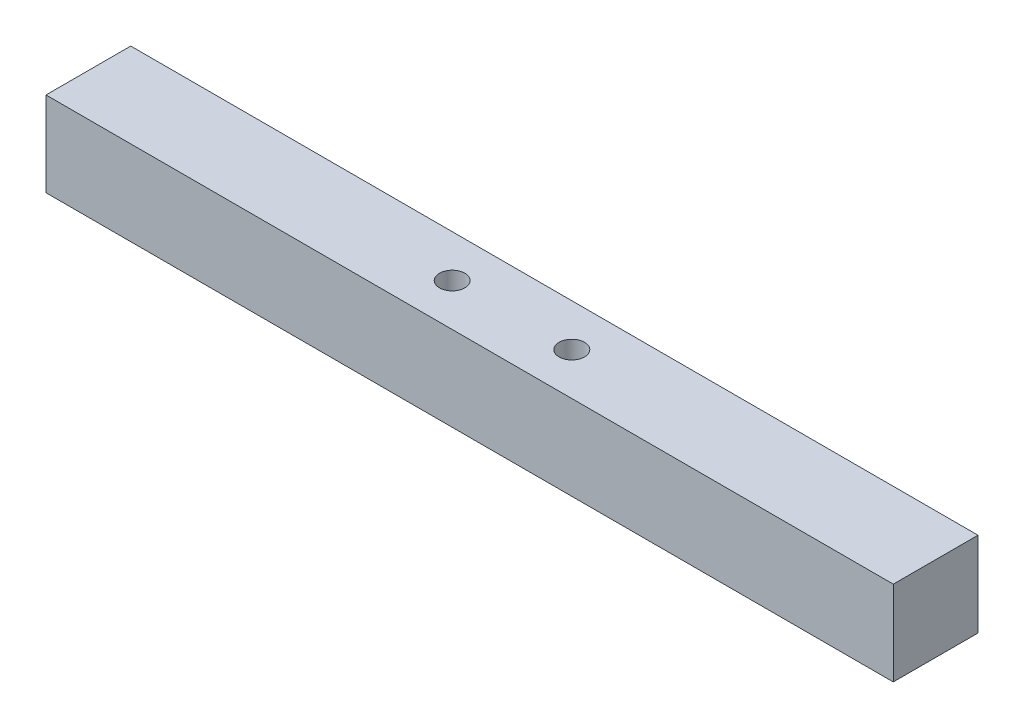
ISO-10303-21;
HEADER;
FILE_DESCRIPTION(('STEP AP214'),'2;1');
FILE_NAME('part.step','',(''),(''),'','','');
FILE_SCHEMA(('AUTOMOTIVE_DESIGN { 1 0 10303 214 1 1 1 1 }'));
ENDSEC;
DATA;
#1=APPLICATION_CONTEXT('core data for automotive mechanical design processes');
#2=APPLICATION_PROTOCOL_DEFINITION('international standard','automotive_design',2000,#1);
#3=PRODUCT_CONTEXT('',#1,'mechanical');
#4=PRODUCT('Part','Part','',(#3));
#5=PRODUCT_RELATED_PRODUCT_CATEGORY('part','',(#4));
#6=PRODUCT_DEFINITION_FORMATION('','',#4);
#7=PRODUCT_DEFINITION_CONTEXT('part definition',#1,'design');
#8=PRODUCT_DEFINITION('design','',#6,#7);
#9=PRODUCT_DEFINITION_SHAPE('','',#8);
#10=(LENGTH_UNIT() NAMED_UNIT(*) SI_UNIT(.MILLI.,.METRE.));
#11=(NAMED_UNIT(*) PLANE_ANGLE_UNIT() SI_UNIT($,.RADIAN.));
#12=(NAMED_UNIT(*) SI_UNIT($,.STERADIAN.) SOLID_ANGLE_UNIT());
#13=UNCERTAINTY_MEASURE_WITH_UNIT(LENGTH_MEASURE(1.E-05),#10,'distance_accuracy_value','');
#14=(GEOMETRIC_REPRESENTATION_CONTEXT(3) GLOBAL_UNCERTAINTY_ASSIGNED_CONTEXT((#13)) GLOBAL_UNIT_ASSIGNED_CONTEXT((#10,
#11,#12)) REPRESENTATION_CONTEXT('',''));
#15=CARTESIAN_POINT('',(0.,0.,0.));
#16=DIRECTION('',(0.,0.,1.));
#17=DIRECTION('',(1.,0.,0.));
#18=AXIS2_PLACEMENT_3D('',#15,#16,#17);
#19=CARTESIAN_POINT('',(200.,-10.,-10.));
#20=DIRECTION('',(0.,0.,1.));
#21=DIRECTION('',(1.,0.,0.));
#22=AXIS2_PLACEMENT_3D('',#19,#20,#21);
#23=PLANE('',#22);
#24=DIRECTION('',(0.,1.,0.));
#25=VECTOR('',#24,1.);
#26=CARTESIAN_POINT('',(0.,-10.,-10.));
#27=LINE('',#26,#25);
#28=CARTESIAN_POINT('',(0.,-10.,-10.));
#29=VERTEX_POINT('',#28);
#30=CARTESIAN_POINT('',(0.,10.,-10.));
#31=VERTEX_POINT('',#30);
#32=EDGE_CURVE('E96',#29,#31,#27,.T.);
#33=ORIENTED_EDGE('',*,*,#32,.T.);
#34=DIRECTION('',(-1.,0.,0.));
#35=VECTOR('',#34,1.);
#36=CARTESIAN_POINT('',(200.,10.,-10.));
#37=LINE('',#36,#35);
#38=CARTESIAN_POINT('',(200.,10.,-10.));
#39=VERTEX_POINT('',#38);
#40=EDGE_CURVE('E11',#39,#31,#37,.T.);
#41=ORIENTED_EDGE('',*,*,#40,.F.);
#42=DIRECTION('',(0.,1.,0.));
#43=VECTOR('',#42,1.);
#44=CARTESIAN_POINT('',(200.,-10.,-10.));
#45=LINE('',#44,#43);
#46=CARTESIAN_POINT('',(200.,-10.,-10.));
#47=VERTEX_POINT('',#46);
#48=EDGE_CURVE('E84',#47,#39,#45,.T.);
#49=ORIENTED_EDGE('',*,*,#48,.F.);
#50=DIRECTION('',(-1.,0.,0.));
#51=VECTOR('',#50,1.);
#52=CARTESIAN_POINT('',(200.,-10.,-10.));
#53=LINE('',#52,#51);
#54=EDGE_CURVE('E92',#47,#29,#53,.T.);
#55=ORIENTED_EDGE('',*,*,#54,.T.);
#56=EDGE_LOOP('',(#33,#41,#49,#55));
#57=FACE_BOUND('',#56,.T.);
#58=ADVANCED_FACE('F33',(#57),#23,.F.);
#59=CARTESIAN_POINT('',(200.,10.,10.));
#60=DIRECTION('',(0.,-1.,0.));
#61=DIRECTION('',(0.,0.,-1.));
#62=AXIS2_PLACEMENT_3D('',#59,#60,#61);
#63=PLANE('',#62);
#64=CARTESIAN_POINT('',(85.88,10.,0.));
#65=DIRECTION('',(0.,1.,0.));
#66=DIRECTION('',(0.,0.,1.));
#67=AXIS2_PLACEMENT_3D('',#64,#65,#66);
#68=CIRCLE('',#67,3.00000000000001);
#69=CARTESIAN_POINT('',(85.88,10.,3.00000000000001));
#70=VERTEX_POINT('',#69);
#71=EDGE_CURVE('E116',#70,#70,#68,.T.);
#72=ORIENTED_EDGE('',*,*,#71,.F.);
#73=EDGE_LOOP('',(#72));
#74=FACE_BOUND('',#73,.T.);
#75=CARTESIAN_POINT('',(114.12,10.,0.));
#76=DIRECTION('',(0.,1.,0.));
#77=DIRECTION('',(0.,0.,-1.));
#78=AXIS2_PLACEMENT_3D('',#75,#76,#77);
#79=CIRCLE('',#78,3.00000000000001);
#80=CARTESIAN_POINT('',(114.12,10.,-3.00000000000001));
#81=VERTEX_POINT('',#80);
#82=EDGE_CURVE('E110',#81,#81,#79,.T.);
#83=ORIENTED_EDGE('',*,*,#82,.F.);
#84=EDGE_LOOP('',(#83));
#85=FACE_BOUND('',#84,.T.);
#86=DIRECTION('',(0.,0.,1.));
#87=VECTOR('',#86,1.);
#88=CARTESIAN_POINT('',(0.,10.,10.));
#89=LINE('',#88,#87);
#90=CARTESIAN_POINT('',(0.,10.,10.));
#91=VERTEX_POINT('',#90);
#92=EDGE_CURVE('E88',#31,#91,#89,.T.);
#93=ORIENTED_EDGE('',*,*,#92,.T.);
#94=DIRECTION('',(-1.,0.,0.));
#95=VECTOR('',#94,1.);
#96=CARTESIAN_POINT('',(200.,10.,10.));
#97=LINE('',#96,#95);
#98=CARTESIAN_POINT('',(200.,10.,10.));
#99=VERTEX_POINT('',#98);
#100=EDGE_CURVE('E41',#99,#91,#97,.T.);
#101=ORIENTED_EDGE('',*,*,#100,.F.);
#102=DIRECTION('',(0.,0.,1.));
#103=VECTOR('',#102,1.);
#104=CARTESIAN_POINT('',(200.,10.,10.));
#105=LINE('',#104,#103);
#106=EDGE_CURVE('E79',#39,#99,#105,.T.);
#107=ORIENTED_EDGE('',*,*,#106,.F.);
#108=ORIENTED_EDGE('',*,*,#40,.T.);
#109=EDGE_LOOP('',(#93,#101,#107,#108));
#110=FACE_BOUND('',#109,.T.);
#111=ADVANCED_FACE('F87',(#74,#85,#110),#63,.F.);
#112=CARTESIAN_POINT('',(200.,-10.,10.));
#113=DIRECTION('',(0.,0.,-1.));
#114=DIRECTION('',(-1.,0.,0.));
#115=AXIS2_PLACEMENT_3D('',#112,#113,#114);
#116=PLANE('',#115);
#117=DIRECTION('',(0.,-1.,0.));
#118=VECTOR('',#117,1.);
#119=CARTESIAN_POINT('',(0.,-10.,10.));
#120=LINE('',#119,#118);
#121=CARTESIAN_POINT('',(0.,-10.,10.));
#122=VERTEX_POINT('',#121);
#123=EDGE_CURVE('E66',#91,#122,#120,.T.);
#124=ORIENTED_EDGE('',*,*,#123,.T.);
#125=DIRECTION('',(-1.,0.,0.));
#126=VECTOR('',#125,1.);
#127=CARTESIAN_POINT('',(200.,-10.,10.));
#128=LINE('',#127,#126);
#129=CARTESIAN_POINT('',(200.,-10.,10.));
#130=VERTEX_POINT('',#129);
#131=EDGE_CURVE('E89',#130,#122,#128,.T.);
#132=ORIENTED_EDGE('',*,*,#131,.F.);
#133=DIRECTION('',(0.,-1.,0.));
#134=VECTOR('',#133,1.);
#135=CARTESIAN_POINT('',(200.,-10.,10.));
#136=LINE('',#135,#134);
#137=EDGE_CURVE('E82',#99,#130,#136,.T.);
#138=ORIENTED_EDGE('',*,*,#137,.F.);
#139=ORIENTED_EDGE('',*,*,#100,.T.);
#140=EDGE_LOOP('',(#124,#132,#138,#139));
#141=FACE_BOUND('',#140,.T.);
#142=ADVANCED_FACE('F90',(#141),#116,.F.);
#143=CARTESIAN_POINT('',(200.,-10.,10.));
#144=DIRECTION('',(0.,1.,0.));
#145=DIRECTION('',(0.,0.,1.));
#146=AXIS2_PLACEMENT_3D('',#143,#144,#145);
#147=PLANE('',#146);
#148=CARTESIAN_POINT('',(85.88,-10.,0.));
#149=DIRECTION('',(0.,1.,0.));
#150=DIRECTION('',(0.,0.,1.));
#151=AXIS2_PLACEMENT_3D('',#148,#149,#150);
#152=CIRCLE('',#151,3.00000000000001);
#153=CARTESIAN_POINT('',(85.88,-10.,3.00000000000001));
#154=VERTEX_POINT('',#153);
#155=EDGE_CURVE('E99',#154,#154,#152,.T.);
#156=ORIENTED_EDGE('',*,*,#155,.T.);
#157=EDGE_LOOP('',(#156));
#158=FACE_BOUND('',#157,.T.);
#159=CARTESIAN_POINT('',(114.12,-10.,0.));
#160=DIRECTION('',(0.,1.,0.));
#161=DIRECTION('',(0.,0.,-1.));
#162=AXIS2_PLACEMENT_3D('',#159,#160,#161);
#163=CIRCLE('',#162,3.00000000000001);
#164=CARTESIAN_POINT('',(114.12,-10.,-3.00000000000001));
#165=VERTEX_POINT('',#164);
#166=EDGE_CURVE('E113',#165,#165,#163,.T.);
#167=ORIENTED_EDGE('',*,*,#166,.T.);
#168=EDGE_LOOP('',(#167));
#169=FACE_BOUND('',#168,.T.);
#170=DIRECTION('',(0.,0.,-1.));
#171=VECTOR('',#170,1.);
#172=CARTESIAN_POINT('',(0.,-10.,10.));
#173=LINE('',#172,#171);
#174=EDGE_CURVE('E72',#122,#29,#173,.T.);
#175=ORIENTED_EDGE('',*,*,#174,.T.);
#176=ORIENTED_EDGE('',*,*,#54,.F.);
#177=DIRECTION('',(0.,0.,-1.));
#178=VECTOR('',#177,1.);
#179=CARTESIAN_POINT('',(200.,-10.,10.));
#180=LINE('',#179,#178);
#181=EDGE_CURVE('E49',#130,#47,#180,.T.);
#182=ORIENTED_EDGE('',*,*,#181,.F.);
#183=ORIENTED_EDGE('',*,*,#131,.T.);
#184=EDGE_LOOP('',(#175,#176,#182,#183));
#185=FACE_BOUND('',#184,.T.);
#186=ADVANCED_FACE('F104',(#158,#169,#185),#147,.F.);
#187=CARTESIAN_POINT('',(200.,0.,0.));
#188=DIRECTION('',(-1.,0.,0.));
#189=DIRECTION('',(0.,0.,1.));
#190=AXIS2_PLACEMENT_3D('',#187,#188,#189);
#191=PLANE('',#190);
#192=ORIENTED_EDGE('',*,*,#48,.T.);
#193=ORIENTED_EDGE('',*,*,#106,.T.);
#194=ORIENTED_EDGE('',*,*,#137,.T.);
#195=ORIENTED_EDGE('',*,*,#181,.T.);
#196=EDGE_LOOP('',(#192,#193,#194,#195));
#197=FACE_BOUND('',#196,.T.);
#198=ADVANCED_FACE('F80',(#197),#191,.F.);
#199=CARTESIAN_POINT('',(0.,0.,0.));
#200=DIRECTION('',(-1.,0.,0.));
#201=DIRECTION('',(0.,0.,1.));
#202=AXIS2_PLACEMENT_3D('',#199,#200,#201);
#203=PLANE('',#202);
#204=ORIENTED_EDGE('',*,*,#32,.F.);
#205=ORIENTED_EDGE('',*,*,#174,.F.);
#206=ORIENTED_EDGE('',*,*,#123,.F.);
#207=ORIENTED_EDGE('',*,*,#92,.F.);
#208=EDGE_LOOP('',(#204,#205,#206,#207));
#209=FACE_BOUND('',#208,.T.);
#210=ADVANCED_FACE('F107',(#209),#203,.T.);
#211=CARTESIAN_POINT('',(114.12,-10.,0.));
#212=DIRECTION('',(0.,1.,0.));
#213=DIRECTION('',(0.,0.,1.));
#214=AXIS2_PLACEMENT_3D('',#211,#212,#213);
#215=CYLINDRICAL_SURFACE('',#214,3.00000000000001);
#216=ORIENTED_EDGE('',*,*,#166,.F.);
#217=EDGE_LOOP('',(#216));
#218=FACE_BOUND('',#217,.T.);
#219=ORIENTED_EDGE('',*,*,#82,.T.);
#220=EDGE_LOOP('',(#219));
#221=FACE_BOUND('',#220,.T.);
#222=ADVANCED_FACE('F127',(#218,#221),#215,.F.);
#223=CARTESIAN_POINT('',(85.88,-10.,0.));
#224=DIRECTION('',(0.,1.,0.));
#225=DIRECTION('',(0.,0.,1.));
#226=AXIS2_PLACEMENT_3D('',#223,#224,#225);
#227=CYLINDRICAL_SURFACE('',#226,3.00000000000001);
#228=ORIENTED_EDGE('',*,*,#155,.F.);
#229=EDGE_LOOP('',(#228));
#230=FACE_BOUND('',#229,.T.);
#231=ORIENTED_EDGE('',*,*,#71,.T.);
#232=EDGE_LOOP('',(#231));
#233=FACE_BOUND('',#232,.T.);
#234=ADVANCED_FACE('F124',(#230,#233),#227,.F.);
#235=CLOSED_SHELL('',(#58,#111,#142,#186,#198,#210,#222,#234));
#236=MANIFOLD_SOLID_BREP('B2',#235);
#237=ADVANCED_BREP_SHAPE_REPRESENTATION('',(#18,#236),#14);
#238=SHAPE_DEFINITION_REPRESENTATION(#9,#237);
ENDSEC;
END-ISO-10303-21;
